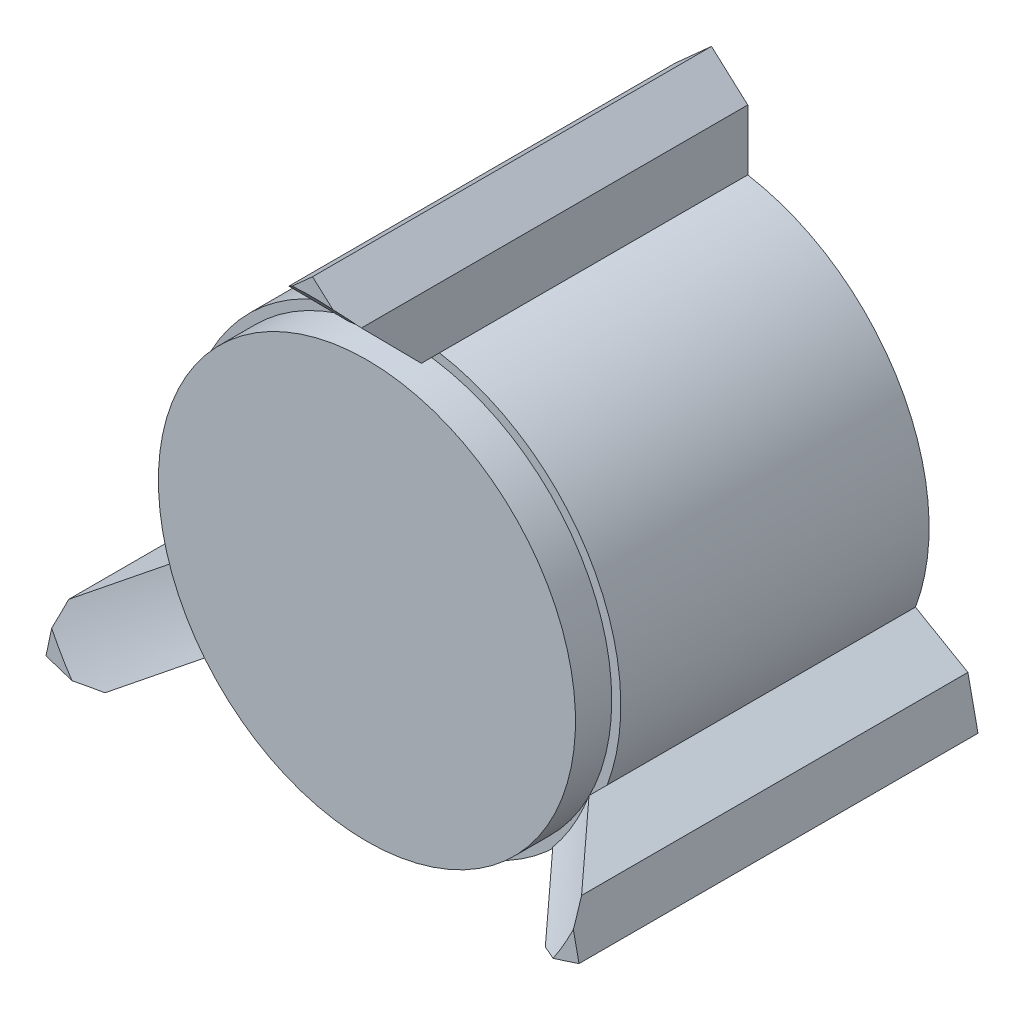
ISO-10303-21;
HEADER;
FILE_DESCRIPTION(('STEP AP214'),'2;1');
FILE_NAME('part.step','',(''),(''),'','','');
FILE_SCHEMA(('AUTOMOTIVE_DESIGN { 1 0 10303 214 1 1 1 1 }'));
ENDSEC;
DATA;
#1=APPLICATION_CONTEXT('core data for automotive mechanical design processes');
#2=APPLICATION_PROTOCOL_DEFINITION('international standard','automotive_design',2000,#1);
#3=PRODUCT_CONTEXT('',#1,'mechanical');
#4=PRODUCT('Part','Part','',(#3));
#5=PRODUCT_RELATED_PRODUCT_CATEGORY('part','',(#4));
#6=PRODUCT_DEFINITION_FORMATION('','',#4);
#7=PRODUCT_DEFINITION_CONTEXT('part definition',#1,'design');
#8=PRODUCT_DEFINITION('design','',#6,#7);
#9=PRODUCT_DEFINITION_SHAPE('','',#8);
#10=(LENGTH_UNIT() NAMED_UNIT(*) SI_UNIT(.MILLI.,.METRE.));
#11=(NAMED_UNIT(*) PLANE_ANGLE_UNIT() SI_UNIT($,.RADIAN.));
#12=(NAMED_UNIT(*) SI_UNIT($,.STERADIAN.) SOLID_ANGLE_UNIT());
#13=UNCERTAINTY_MEASURE_WITH_UNIT(LENGTH_MEASURE(1.E-05),#10,'distance_accuracy_value','');
#14=(GEOMETRIC_REPRESENTATION_CONTEXT(3) GLOBAL_UNCERTAINTY_ASSIGNED_CONTEXT((#13)) GLOBAL_UNIT_ASSIGNED_CONTEXT((#10,
#11,#12)) REPRESENTATION_CONTEXT('',''));
#15=CARTESIAN_POINT('',(0.,0.,0.));
#16=DIRECTION('',(0.,0.,1.));
#17=DIRECTION('',(1.,0.,0.));
#18=AXIS2_PLACEMENT_3D('',#15,#16,#17);
#19=CARTESIAN_POINT('',(0.,0.,12.));
#20=DIRECTION('',(0.,0.,-1.));
#21=DIRECTION('',(-1.,0.,0.));
#22=AXIS2_PLACEMENT_3D('',#19,#20,#21);
#23=CYLINDRICAL_SURFACE('',#22,12.);
#24=DIRECTION('',(0.,0.,-1.));
#25=VECTOR('',#24,1.);
#26=CARTESIAN_POINT('',(-9.2469507659596,-7.64813059066844,30.7456411372333));
#27=LINE('',#26,#25);
#28=CARTESIAN_POINT('',(-9.24695076595963,-7.64813059066846,12.));
#29=VERTEX_POINT('',#28);
#30=CARTESIAN_POINT('',(-9.2469507659596,-7.64813059066844,-5.));
#31=VERTEX_POINT('',#30);
#32=EDGE_CURVE('E418',#29,#31,#27,.T.);
#33=ORIENTED_EDGE('',*,*,#32,.T.);
#34=CARTESIAN_POINT('',(0.,0.,-5.));
#35=DIRECTION('',(0.,0.,-1.));
#36=DIRECTION('',(-1.,0.,0.));
#37=AXIS2_PLACEMENT_3D('',#34,#35,#36);
#38=CIRCLE('',#37,12.);
#39=CARTESIAN_POINT('',(9.24695076595962,-7.64813059066844,-5.));
#40=VERTEX_POINT('',#39);
#41=EDGE_CURVE('E218',#40,#31,#38,.T.);
#42=ORIENTED_EDGE('',*,*,#41,.F.);
#43=DIRECTION('',(0.,0.,-1.));
#44=VECTOR('',#43,1.);
#45=CARTESIAN_POINT('',(9.24695076595961,-7.64813059066843,30.7456411372333));
#46=LINE('',#45,#44);
#47=CARTESIAN_POINT('',(9.24695076595964,-7.64813059066845,12.));
#48=VERTEX_POINT('',#47);
#49=EDGE_CURVE('E461',#48,#40,#46,.T.);
#50=ORIENTED_EDGE('',*,*,#49,.F.);
#51=CARTESIAN_POINT('',(0.,0.,12.));
#52=DIRECTION('',(0.,0.,1.));
#53=DIRECTION('',(1.,0.,0.));
#54=AXIS2_PLACEMENT_3D('',#51,#52,#53);
#55=CIRCLE('',#54,12.);
#56=EDGE_CURVE('E248',#29,#48,#55,.T.);
#57=ORIENTED_EDGE('',*,*,#56,.F.);
#58=EDGE_LOOP('',(#33,#42,#50,#57));
#59=FACE_BOUND('',#58,.T.);
#60=ADVANCED_FACE('F43',(#59),#23,.T.);
#61=DIRECTION('',(0.,0.,-1.));
#62=VECTOR('',#61,1.);
#63=CARTESIAN_POINT('',(-11.2469507659596,-4.18402897553068,30.7456411372333));
#64=LINE('',#63,#62);
#65=CARTESIAN_POINT('',(-11.2469507659596,-4.18402897553069,12.));
#66=VERTEX_POINT('',#65);
#67=CARTESIAN_POINT('',(-11.2469507659596,-4.18402897553069,-5.));
#68=VERTEX_POINT('',#67);
#69=EDGE_CURVE('E444',#66,#68,#64,.T.);
#70=ORIENTED_EDGE('',*,*,#69,.F.);
#71=CARTESIAN_POINT('',(-2.,11.8321595661992,12.));
#72=VERTEX_POINT('',#71);
#73=EDGE_CURVE('E201',#72,#66,#55,.T.);
#74=ORIENTED_EDGE('',*,*,#73,.F.);
#75=DIRECTION('',(0.,0.,-1.));
#76=VECTOR('',#75,1.);
#77=CARTESIAN_POINT('',(-2.,11.8321595661992,12.));
#78=LINE('',#77,#76);
#79=CARTESIAN_POINT('',(-1.99999999999999,11.8321595661992,-5.));
#80=VERTEX_POINT('',#79);
#81=EDGE_CURVE('E194',#80,#72,#78,.F.);
#82=ORIENTED_EDGE('',*,*,#81,.F.);
#83=EDGE_CURVE('E198',#68,#80,#38,.T.);
#84=ORIENTED_EDGE('',*,*,#83,.F.);
#85=EDGE_LOOP('',(#70,#74,#82,#84));
#86=FACE_BOUND('',#85,.T.);
#87=ADVANCED_FACE('F197',(#86),#23,.T.);
#88=DIRECTION('',(0.,0.,-1.));
#89=VECTOR('',#88,1.);
#90=CARTESIAN_POINT('',(11.2469507659596,-4.18402897553067,30.7456411372333));
#91=LINE('',#90,#89);
#92=CARTESIAN_POINT('',(11.2469507659596,-4.18402897553068,12.));
#93=VERTEX_POINT('',#92);
#94=CARTESIAN_POINT('',(11.2469507659596,-4.18402897553068,-5.));
#95=VERTEX_POINT('',#94);
#96=EDGE_CURVE('E457',#93,#95,#91,.T.);
#97=ORIENTED_EDGE('',*,*,#96,.T.);
#98=CARTESIAN_POINT('',(2.,11.8321595661992,-5.));
#99=VERTEX_POINT('',#98);
#100=EDGE_CURVE('E220',#99,#95,#38,.T.);
#101=ORIENTED_EDGE('',*,*,#100,.F.);
#102=DIRECTION('',(0.,0.,-1.));
#103=VECTOR('',#102,1.);
#104=CARTESIAN_POINT('',(2.,11.8321595661992,12.));
#105=LINE('',#104,#103);
#106=CARTESIAN_POINT('',(2.,11.8321595661992,12.));
#107=VERTEX_POINT('',#106);
#108=EDGE_CURVE('E208',#107,#99,#105,.T.);
#109=ORIENTED_EDGE('',*,*,#108,.F.);
#110=EDGE_CURVE('E243',#93,#107,#55,.T.);
#111=ORIENTED_EDGE('',*,*,#110,.F.);
#112=EDGE_LOOP('',(#97,#101,#109,#111));
#113=FACE_BOUND('',#112,.T.);
#114=ADVANCED_FACE('F404',(#113),#23,.T.);
#115=CARTESIAN_POINT('',(0.,0.,12.));
#116=DIRECTION('',(0.,0.,1.));
#117=DIRECTION('',(1.,0.,0.));
#118=AXIS2_PLACEMENT_3D('',#115,#116,#117);
#119=PLANE('',#118);
#120=CARTESIAN_POINT('',(0.,0.,12.));
#121=DIRECTION('',(0.,0.,1.));
#122=DIRECTION('',(1.,0.,0.));
#123=AXIS2_PLACEMENT_3D('',#120,#121,#122);
#124=CIRCLE('',#123,11.5);
#125=CARTESIAN_POINT('',(11.5,0.,12.));
#126=VERTEX_POINT('',#125);
#127=EDGE_CURVE('E247',#126,#126,#124,.T.);
#128=ORIENTED_EDGE('',*,*,#127,.F.);
#129=EDGE_LOOP('',(#128));
#130=FACE_BOUND('',#129,.T.);
#131=EDGE_CURVE('E244',#107,#72,#55,.T.);
#132=ORIENTED_EDGE('',*,*,#131,.T.);
#133=ORIENTED_EDGE('',*,*,#73,.T.);
#134=CARTESIAN_POINT('',(0.,0.,12.));
#135=DIRECTION('',(0.,0.,1.));
#136=DIRECTION('',(1.,0.,0.));
#137=AXIS2_PLACEMENT_3D('',#134,#135,#136);
#138=CIRCLE('',#137,12.);
#139=EDGE_CURVE('E448',#66,#29,#138,.T.);
#140=ORIENTED_EDGE('',*,*,#139,.T.);
#141=ORIENTED_EDGE('',*,*,#56,.T.);
#142=CARTESIAN_POINT('',(0.,0.,12.));
#143=DIRECTION('',(0.,0.,1.));
#144=DIRECTION('',(1.,0.,0.));
#145=AXIS2_PLACEMENT_3D('',#142,#143,#144);
#146=CIRCLE('',#145,12.);
#147=EDGE_CURVE('E233',#48,#93,#146,.T.);
#148=ORIENTED_EDGE('',*,*,#147,.T.);
#149=ORIENTED_EDGE('',*,*,#110,.T.);
#150=EDGE_LOOP('',(#132,#133,#140,#141,#148,#149));
#151=FACE_BOUND('',#150,.T.);
#152=ADVANCED_FACE('F401',(#130,#151),#119,.T.);
#153=CARTESIAN_POINT('',(0.,0.,12.));
#154=DIRECTION('',(0.,0.,-1.));
#155=DIRECTION('',(0.,1.,0.));
#156=AXIS2_PLACEMENT_3D('',#153,#154,#155);
#157=CYLINDRICAL_SURFACE('',#156,11.5);
#158=CARTESIAN_POINT('',(0.,0.,14.));
#159=DIRECTION('',(0.,0.,-1.));
#160=DIRECTION('',(0.,1.,0.));
#161=AXIS2_PLACEMENT_3D('',#158,#159,#160);
#162=CIRCLE('',#161,11.5);
#163=CARTESIAN_POINT('',(0.,11.5,14.));
#164=VERTEX_POINT('',#163);
#165=EDGE_CURVE('E239',#164,#164,#162,.T.);
#166=ORIENTED_EDGE('',*,*,#165,.T.);
#167=EDGE_LOOP('',(#166));
#168=FACE_BOUND('',#167,.T.);
#169=ORIENTED_EDGE('',*,*,#127,.T.);
#170=EDGE_LOOP('',(#169));
#171=FACE_BOUND('',#170,.T.);
#172=ADVANCED_FACE('F397',(#168,#171),#157,.T.);
#173=CARTESIAN_POINT('',(0.,11.5,14.));
#174=DIRECTION('',(0.,0.,1.));
#175=DIRECTION('',(0.,-1.,0.));
#176=AXIS2_PLACEMENT_3D('',#173,#174,#175);
#177=PLANE('',#176);
#178=ORIENTED_EDGE('',*,*,#165,.F.);
#179=EDGE_LOOP('',(#178));
#180=FACE_BOUND('',#179,.T.);
#181=ADVANCED_FACE('F389',(#180),#177,.T.);
#182=CARTESIAN_POINT('',(-2.,16.8819430161342,30.7456411372333));
#183=DIRECTION('',(1.,0.,0.));
#184=DIRECTION('',(0.,1.,0.));
#185=AXIS2_PLACEMENT_3D('',#182,#183,#184);
#186=PLANE('',#185);
#187=DIRECTION('',(0.,0.,-1.));
#188=VECTOR('',#187,1.);
#189=CARTESIAN_POINT('',(-2.,11.8321595661993,30.7456411372333));
#190=LINE('',#189,#188);
#191=CARTESIAN_POINT('',(-2.,11.8321595661993,13.));
#192=VERTEX_POINT('',#191);
#193=EDGE_CURVE('E225',#192,#72,#190,.T.);
#194=ORIENTED_EDGE('',*,*,#193,.F.);
#195=CARTESIAN_POINT('',(-2.,11.8321595661993,13.));
#196=CARTESIAN_POINT('',(-2.,12.1109211158368,13.2748665394307));
#197=CARTESIAN_POINT('',(-2.,12.3895517622911,13.5498657628408));
#198=CARTESIAN_POINT('',(-2.,12.9465913662465,14.1000884014354));
#199=CARTESIAN_POINT('',(-2.,13.2250003238489,14.3753118165174));
#200=CARTESIAN_POINT('',(-2.,13.781636880291,14.9259418720893));
#201=CARTESIAN_POINT('',(-2.,14.0598644791582,15.2013485125516));
#202=CARTESIAN_POINT('',(-2.,14.6161663032564,15.7523169105655));
#203=CARTESIAN_POINT('',(-2.,14.8942405284174,16.0278786681878));
#204=CARTESIAN_POINT('',(-2.,15.1722519114186,16.3035037838902));
#205=B_SPLINE_CURVE_WITH_KNOTS('',3,(#195,#196,#197,#198,#199,#200,#201,#202,#203,#204),
.UNSPECIFIED.,.F.,.F.,(4,2,2,2,4),(0.,1.17445147402427,2.34890241094299,3.52335317013223,
4.6978044645796),.UNSPECIFIED.);
#206=CARTESIAN_POINT('',(-2.,15.1722519114186,16.3035037838902));
#207=VERTEX_POINT('',#206);
#208=EDGE_CURVE('E370',#192,#207,#205,.T.);
#209=ORIENTED_EDGE('',*,*,#208,.T.);
#210=DIRECTION('',(0.,0.,-1.));
#211=VECTOR('',#210,1.);
#212=CARTESIAN_POINT('',(-2.,15.1722519114186,30.7456411372333));
#213=LINE('',#212,#211);
#214=CARTESIAN_POINT('',(-2.,15.1722519114186,-5.));
#215=VERTEX_POINT('',#214);
#216=EDGE_CURVE('E223',#207,#215,#213,.T.);
#217=ORIENTED_EDGE('',*,*,#216,.T.);
#218=DIRECTION('',(0.,1.,0.));
#219=VECTOR('',#218,1.);
#220=CARTESIAN_POINT('',(-2.,16.8819430161342,-5.));
#221=LINE('',#220,#219);
#222=EDGE_CURVE('E213',#80,#215,#221,.T.);
#223=ORIENTED_EDGE('',*,*,#222,.F.);
#224=ORIENTED_EDGE('',*,*,#81,.T.);
#225=EDGE_LOOP('',(#194,#209,#217,#223,#224));
#226=FACE_BOUND('',#225,.T.);
#227=ADVANCED_FACE('F221',(#226),#186,.F.);
#228=CARTESIAN_POINT('',(0.,0.,30.7456411372333));
#229=DIRECTION('',(0.,0.,-1.));
#230=DIRECTION('',(-1.,0.,0.));
#231=AXIS2_PLACEMENT_3D('',#228,#229,#230);
#232=CYLINDRICAL_SURFACE('',#231,12.0000000000001);
#233=DIRECTION('',(0.,0.,-1.));
#234=VECTOR('',#233,1.);
#235=CARTESIAN_POINT('',(2.,11.8321595661993,30.7456411372333));
#236=LINE('',#235,#234);
#237=CARTESIAN_POINT('',(2.,11.8321595661993,13.));
#238=VERTEX_POINT('',#237);
#239=EDGE_CURVE('E230',#238,#107,#236,.T.);
#240=ORIENTED_EDGE('',*,*,#239,.F.);
#241=CARTESIAN_POINT('',(0.,0.,13.));
#242=DIRECTION('',(0.,0.,1.));
#243=DIRECTION('',(1.,0.,0.));
#244=AXIS2_PLACEMENT_3D('',#241,#242,#243);
#245=CIRCLE('',#244,12.0000000000001);
#246=EDGE_CURVE('E378',#238,#192,#245,.T.);
#247=ORIENTED_EDGE('',*,*,#246,.T.);
#248=ORIENTED_EDGE('',*,*,#193,.T.);
#249=ORIENTED_EDGE('',*,*,#131,.F.);
#250=EDGE_LOOP('',(#240,#247,#248,#249));
#251=FACE_BOUND('',#250,.T.);
#252=ADVANCED_FACE('F388',(#251),#232,.F.);
#253=CARTESIAN_POINT('',(2.,11.8321595661993,30.7456411372333));
#254=DIRECTION('',(-1.,0.,0.));
#255=DIRECTION('',(0.,-1.,0.));
#256=AXIS2_PLACEMENT_3D('',#253,#254,#255);
#257=PLANE('',#256);
#258=DIRECTION('',(0.,0.,1.));
#259=VECTOR('',#258,1.);
#260=CARTESIAN_POINT('',(2.,15.1722519114186,30.7456411372333));
#261=LINE('',#260,#259);
#262=CARTESIAN_POINT('',(2.,15.1722519114186,-5.));
#263=VERTEX_POINT('',#262);
#264=CARTESIAN_POINT('',(2.,15.1722519114186,16.3035037838902));
#265=VERTEX_POINT('',#264);
#266=EDGE_CURVE('E259',#263,#265,#261,.T.);
#267=ORIENTED_EDGE('',*,*,#266,.T.);
#268=CARTESIAN_POINT('',(2.,15.1722519114186,16.3035037838902));
#269=CARTESIAN_POINT('',(2.,14.8942405284174,16.0278786681878));
#270=CARTESIAN_POINT('',(2.,14.6161663032564,15.7523169105655));
#271=CARTESIAN_POINT('',(2.,14.0598644791582,15.2013485125516));
#272=CARTESIAN_POINT('',(2.,13.781636880291,14.9259418720893));
#273=CARTESIAN_POINT('',(2.,13.2250003238489,14.3753118165174));
#274=CARTESIAN_POINT('',(2.,12.9465913662465,14.1000884014354));
#275=CARTESIAN_POINT('',(2.,12.3895517622911,13.5498657628408));
#276=CARTESIAN_POINT('',(2.,12.1109211158368,13.2748665394307));
#277=CARTESIAN_POINT('',(2.,11.8321595661993,13.));
#278=B_SPLINE_CURVE_WITH_KNOTS('',3,(#268,#269,#270,#271,#272,#273,#274,#275,#276,#277),
.UNSPECIFIED.,.F.,.F.,(4,2,2,2,4),(0.,1.17445129444737,2.34890205363661,3.52335299055532,
4.69780446457959),.UNSPECIFIED.);
#279=EDGE_CURVE('E337',#265,#238,#278,.T.);
#280=ORIENTED_EDGE('',*,*,#279,.T.);
#281=ORIENTED_EDGE('',*,*,#239,.T.);
#282=ORIENTED_EDGE('',*,*,#108,.T.);
#283=DIRECTION('',(0.,-1.,0.));
#284=VECTOR('',#283,1.);
#285=CARTESIAN_POINT('',(2.,11.8321595661993,-5.));
#286=LINE('',#285,#284);
#287=EDGE_CURVE('E226',#263,#99,#286,.T.);
#288=ORIENTED_EDGE('',*,*,#287,.F.);
#289=EDGE_LOOP('',(#267,#280,#281,#282,#288));
#290=FACE_BOUND('',#289,.T.);
#291=ADVANCED_FACE('F393',(#290),#257,.F.);
#292=CARTESIAN_POINT('',(0.,0.,17.));
#293=DIRECTION('',(0.,0.,1.));
#294=DIRECTION('',(1.,0.,0.));
#295=AXIS2_PLACEMENT_3D('',#292,#293,#294);
#296=PLANE('',#295);
#297=DIRECTION('',(0.743764886323458,0.668441316700467,0.));
#298=VECTOR('',#297,1.);
#299=CARTESIAN_POINT('',(-8.43671259471871,9.38740683315135,17.));
#300=LINE('',#299,#298);
#301=CARTESIAN_POINT('',(0.,16.96970518998,17.));
#302=VERTEX_POINT('',#301);
#303=CARTESIAN_POINT('',(-1.12287217277841,15.960550055797,17.));
#304=VERTEX_POINT('',#303);
#305=EDGE_CURVE('E263',#302,#304,#300,.F.);
#306=ORIENTED_EDGE('',*,*,#305,.T.);
#307=CARTESIAN_POINT('',(0.,0.,17.));
#308=DIRECTION('',(0.,0.,1.));
#309=DIRECTION('',(1.,0.,0.));
#310=AXIS2_PLACEMENT_3D('',#307,#308,#309);
#311=CIRCLE('',#310,16.0000000000001);
#312=CARTESIAN_POINT('',(1.1228721727784,15.960550055797,17.));
#313=VERTEX_POINT('',#312);
#314=EDGE_CURVE('E312',#304,#313,#311,.F.);
#315=ORIENTED_EDGE('',*,*,#314,.T.);
#316=DIRECTION('',(0.743764886323458,-0.668441316700467,0.));
#317=VECTOR('',#316,1.);
#318=CARTESIAN_POINT('',(8.43671259471871,9.38740683315135,17.));
#319=LINE('',#318,#317);
#320=EDGE_CURVE('E267',#313,#302,#319,.F.);
#321=ORIENTED_EDGE('',*,*,#320,.T.);
#322=EDGE_LOOP('',(#306,#315,#321));
#323=FACE_BOUND('',#322,.T.);
#324=ADVANCED_FACE('F390',(#323),#296,.T.);
#325=CARTESIAN_POINT('',(0.,0.,-5.));
#326=DIRECTION('',(0.,0.,1.));
#327=DIRECTION('',(1.,0.,0.));
#328=AXIS2_PLACEMENT_3D('',#325,#326,#327);
#329=PLANE('',#328);
#330=DIRECTION('',(-0.743764886323458,-0.668441316700467,0.));
#331=VECTOR('',#330,1.);
#332=CARTESIAN_POINT('',(-2.,15.1722519114186,-5.));
#333=LINE('',#332,#331);
#334=CARTESIAN_POINT('',(0.,16.96970518998,-5.));
#335=VERTEX_POINT('',#334);
#336=EDGE_CURVE('E207',#215,#335,#333,.F.);
#337=ORIENTED_EDGE('',*,*,#336,.T.);
#338=DIRECTION('',(-0.743764886323458,0.668441316700467,0.));
#339=VECTOR('',#338,1.);
#340=CARTESIAN_POINT('',(-0.0336714886521954,16.9999666538159,-5.));
#341=LINE('',#340,#339);
#342=EDGE_CURVE('E256',#335,#263,#341,.F.);
#343=ORIENTED_EDGE('',*,*,#342,.T.);
#344=ORIENTED_EDGE('',*,*,#287,.T.);
#345=ORIENTED_EDGE('',*,*,#100,.T.);
#346=DIRECTION('',(0.866025403784439,-0.499999999999999,0.));
#347=VECTOR('',#346,1.);
#348=CARTESIAN_POINT('',(15.6201915172134,-6.70892070049812,-5.));
#349=LINE('',#348,#347);
#350=CARTESIAN_POINT('',(14.1395555879055,-5.85407514814032,-5.));
#351=VERTEX_POINT('',#350);
#352=EDGE_CURVE('E453',#95,#351,#349,.T.);
#353=ORIENTED_EDGE('',*,*,#352,.T.);
#354=DIRECTION('',(-0.207004718039996,0.978339944349193,0.));
#355=VECTOR('',#354,1.);
#356=CARTESIAN_POINT('',(14.1395555879055,-5.85407514814032,-5.));
#357=LINE('',#356,#355);
#358=CARTESIAN_POINT('',(14.6961957892552,-8.48485259498989,-5.));
#359=VERTEX_POINT('',#358);
#360=EDGE_CURVE('E292',#351,#359,#357,.F.);
#361=ORIENTED_EDGE('',*,*,#360,.T.);
#362=DIRECTION('',(0.950769604363452,0.309898627648727,0.));
#363=VECTOR('',#362,1.);
#364=CARTESIAN_POINT('',(14.739238730019,-8.47082296235183,-5.));
#365=LINE('',#364,#363);
#366=CARTESIAN_POINT('',(12.1395555879055,-9.31817676327808,-5.));
#367=VERTEX_POINT('',#366);
#368=EDGE_CURVE('E295',#359,#367,#365,.F.);
#369=ORIENTED_EDGE('',*,*,#368,.T.);
#370=DIRECTION('',(-0.866025403784439,0.5,0.));
#371=VECTOR('',#370,1.);
#372=CARTESIAN_POINT('',(9.2469507659596,-7.64813059066843,-5.));
#373=LINE('',#372,#371);
#374=EDGE_CURVE('E433',#367,#40,#373,.T.);
#375=ORIENTED_EDGE('',*,*,#374,.T.);
#376=ORIENTED_EDGE('',*,*,#41,.T.);
#377=DIRECTION('',(-0.866025403784438,-0.500000000000001,0.));
#378=VECTOR('',#377,1.);
#379=CARTESIAN_POINT('',(-13.6201915172134,-10.1730223156359,-5.));
#380=LINE('',#379,#378);
#381=CARTESIAN_POINT('',(-12.1395555879055,-9.31817676327809,-5.));
#382=VERTEX_POINT('',#381);
#383=EDGE_CURVE('E429',#31,#382,#380,.T.);
#384=ORIENTED_EDGE('',*,*,#383,.T.);
#385=DIRECTION('',(0.950769604363453,-0.309898627648726,0.));
#386=VECTOR('',#385,1.);
#387=CARTESIAN_POINT('',(-12.1395555879055,-9.31817676327809,-5.));
#388=LINE('',#387,#386);
#389=CARTESIAN_POINT('',(-14.6961957892552,-8.4848525949899,-5.));
#390=VERTEX_POINT('',#389);
#391=EDGE_CURVE('E278',#382,#390,#388,.F.);
#392=ORIENTED_EDGE('',*,*,#391,.T.);
#393=DIRECTION('',(-0.207004718039995,-0.978339944349193,0.));
#394=VECTOR('',#393,1.);
#395=CARTESIAN_POINT('',(-14.7055672413668,-8.52914369146392,-5.));
#396=LINE('',#395,#394);
#397=CARTESIAN_POINT('',(-14.1395555879055,-5.85407514814033,-5.));
#398=VERTEX_POINT('',#397);
#399=EDGE_CURVE('E275',#390,#398,#396,.F.);
#400=ORIENTED_EDGE('',*,*,#399,.T.);
#401=DIRECTION('',(0.866025403784439,0.5,0.));
#402=VECTOR('',#401,1.);
#403=CARTESIAN_POINT('',(-11.2469507659596,-4.18402897553068,-5.));
#404=LINE('',#403,#402);
#405=EDGE_CURVE('E216',#398,#68,#404,.T.);
#406=ORIENTED_EDGE('',*,*,#405,.T.);
#407=ORIENTED_EDGE('',*,*,#83,.T.);
#408=ORIENTED_EDGE('',*,*,#222,.T.);
#409=EDGE_LOOP('',(#337,#343,#344,#345,#353,#361,#369,#375,#376,#384,#392,#400,#406,#407,#408));
#410=FACE_BOUND('',#409,.T.);
#411=ADVANCED_FACE('F212',(#410),#329,.F.);
#412=CARTESIAN_POINT('',(15.6201915172134,-6.70892070049812,30.7456411372333));
#413=DIRECTION('',(-0.499999999999999,-0.866025403784439,0.));
#414=DIRECTION('',(0.866025403784439,-0.499999999999999,0.));
#415=AXIS2_PLACEMENT_3D('',#412,#413,#414);
#416=PLANE('',#415);
#417=CARTESIAN_POINT('',(11.2469507659596,-4.18402897553067,13.));
#418=VERTEX_POINT('',#417);
#419=EDGE_CURVE('E458',#418,#93,#91,.T.);
#420=ORIENTED_EDGE('',*,*,#419,.F.);
#421=CARTESIAN_POINT('',(11.2469507659596,-4.18402897553067,13.));
#422=CARTESIAN_POINT('',(11.488365349544,-4.32340975034941,13.2748665394307));
#423=CARTESIAN_POINT('',(11.7296665676463,-4.46272507357658,13.5498657628408));
#424=CARTESIAN_POINT('',(12.2120770155857,-4.74124487555427,14.1000884014355));
#425=CARTESIAN_POINT('',(12.4531862455105,-4.88044935435546,14.3753118165174));
#426=CARTESIAN_POINT('',(12.9352476440645,-5.15876763257652,14.9259418720894));
#427=CARTESIAN_POINT('',(13.1761998127174,-5.29788143201011,15.2013485125517));
#428=CARTESIAN_POINT('',(13.657971324558,-5.5760323440592,15.7523169105656));
#429=CARTESIAN_POINT('',(13.8987906676852,-5.71506945663974,16.0278786681878));
#430=CARTESIAN_POINT('',(14.1395555879055,-5.85407514814032,16.3035037838903));
#431=B_SPLINE_CURVE_WITH_KNOTS('',3,(#421,#422,#423,#424,#425,#426,#427,#428,#429,#430),
.UNSPECIFIED.,.F.,.F.,(4,2,2,2,4),(0.,1.17445147402428,2.34890241094299,3.52335317013224,
4.69780446457961),.UNSPECIFIED.);
#432=CARTESIAN_POINT('',(14.1395555879055,-5.85407514814032,16.3035037838903));
#433=VERTEX_POINT('',#432);
#434=EDGE_CURVE('E59',#418,#433,#431,.T.);
#435=ORIENTED_EDGE('',*,*,#434,.T.);
#436=DIRECTION('',(0.,0.,-1.));
#437=VECTOR('',#436,1.);
#438=CARTESIAN_POINT('',(14.1395555879055,-5.85407514814032,30.7456411372333));
#439=LINE('',#438,#437);
#440=EDGE_CURVE('E309',#433,#351,#439,.T.);
#441=ORIENTED_EDGE('',*,*,#440,.T.);
#442=ORIENTED_EDGE('',*,*,#352,.F.);
#443=ORIENTED_EDGE('',*,*,#96,.F.);
#444=EDGE_LOOP('',(#420,#435,#441,#442,#443));
#445=FACE_BOUND('',#444,.T.);
#446=ADVANCED_FACE('F473',(#445),#416,.F.);
#447=CARTESIAN_POINT('',(0.,0.,30.7456411372333));
#448=DIRECTION('',(0.,0.,-1.));
#449=DIRECTION('',(-1.,0.,0.));
#450=AXIS2_PLACEMENT_3D('',#447,#448,#449);
#451=CYLINDRICAL_SURFACE('',#450,12.);
#452=CARTESIAN_POINT('',(9.24695076595961,-7.64813059066843,13.));
#453=VERTEX_POINT('',#452);
#454=EDGE_CURVE('E462',#453,#48,#46,.T.);
#455=ORIENTED_EDGE('',*,*,#454,.F.);
#456=CARTESIAN_POINT('',(0.,0.,13.));
#457=DIRECTION('',(0.,0.,1.));
#458=DIRECTION('',(1.,0.,0.));
#459=AXIS2_PLACEMENT_3D('',#456,#457,#458);
#460=CIRCLE('',#459,12.);
#461=EDGE_CURVE('E73',#453,#418,#460,.T.);
#462=ORIENTED_EDGE('',*,*,#461,.T.);
#463=ORIENTED_EDGE('',*,*,#419,.T.);
#464=ORIENTED_EDGE('',*,*,#147,.F.);
#465=EDGE_LOOP('',(#455,#462,#463,#464));
#466=FACE_BOUND('',#465,.T.);
#467=ADVANCED_FACE('F532',(#466),#451,.F.);
#468=CARTESIAN_POINT('',(9.2469507659596,-7.64813059066843,30.7456411372333));
#469=DIRECTION('',(0.5,0.866025403784439,0.));
#470=DIRECTION('',(-0.866025403784439,0.5,0.));
#471=AXIS2_PLACEMENT_3D('',#468,#469,#470);
#472=PLANE('',#471);
#473=DIRECTION('',(0.,0.,1.));
#474=VECTOR('',#473,1.);
#475=CARTESIAN_POINT('',(12.1395555879055,-9.31817676327808,30.7456411372333));
#476=LINE('',#475,#474);
#477=CARTESIAN_POINT('',(12.1395555879055,-9.31817676327808,16.3035037838903));
#478=VERTEX_POINT('',#477);
#479=EDGE_CURVE('E298',#367,#478,#476,.T.);
#480=ORIENTED_EDGE('',*,*,#479,.T.);
#481=CARTESIAN_POINT('',(12.1395555879055,-9.31817676327808,16.3035037838903));
#482=CARTESIAN_POINT('',(11.8987906676852,-9.1791710717775,16.0278786681878));
#483=CARTESIAN_POINT('',(11.657971324558,-9.04013395919696,15.7523169105656));
#484=CARTESIAN_POINT('',(11.1761998127174,-8.76198304714787,15.2013485125517));
#485=CARTESIAN_POINT('',(10.9352476440645,-8.62286924771429,14.9259418720894));
#486=CARTESIAN_POINT('',(10.4531862455105,-8.34455096949323,14.3753118165174));
#487=CARTESIAN_POINT('',(10.2120770155857,-8.20534649069203,14.1000884014355));
#488=CARTESIAN_POINT('',(9.72966656764631,-7.92682668871434,13.5498657628408));
#489=CARTESIAN_POINT('',(9.48836534954399,-7.78751136548718,13.2748665394307));
#490=CARTESIAN_POINT('',(9.24695076595961,-7.64813059066843,13.));
#491=B_SPLINE_CURVE_WITH_KNOTS('',3,(#481,#482,#483,#484,#485,#486,#487,#488,#489,#490),
.UNSPECIFIED.,.F.,.F.,(4,2,2,2,4),(0.,1.17445129444737,2.34890205363661,3.52335299055533,
4.6978044645796),.UNSPECIFIED.);
#492=EDGE_CURVE('E536',#478,#453,#491,.T.);
#493=ORIENTED_EDGE('',*,*,#492,.T.);
#494=ORIENTED_EDGE('',*,*,#454,.T.);
#495=ORIENTED_EDGE('',*,*,#49,.T.);
#496=ORIENTED_EDGE('',*,*,#374,.F.);
#497=EDGE_LOOP('',(#480,#493,#494,#495,#496));
#498=FACE_BOUND('',#497,.T.);
#499=ADVANCED_FACE('F528',(#498),#472,.F.);
#500=CARTESIAN_POINT('',(0.,0.,17.));
#501=DIRECTION('',(0.,0.,1.));
#502=DIRECTION('',(1.,0.,0.));
#503=AXIS2_PLACEMENT_3D('',#500,#501,#502);
#504=PLANE('',#503);
#505=DIRECTION('',(0.207004718039996,-0.978339944349193,0.));
#506=VECTOR('',#505,1.);
#507=CARTESIAN_POINT('',(12.348089090528,2.61270401487887,17.));
#508=LINE('',#507,#506);
#509=CARTESIAN_POINT('',(14.6961957892552,-8.48485259498989,17.));
#510=VERTEX_POINT('',#509);
#511=CARTESIAN_POINT('',(14.3836778930825,-7.00783920106965,17.));
#512=VERTEX_POINT('',#511);
#513=EDGE_CURVE('E302',#510,#512,#508,.F.);
#514=ORIENTED_EDGE('',*,*,#513,.T.);
#515=CARTESIAN_POINT('',(0.,0.,17.));
#516=DIRECTION('',(0.,0.,1.));
#517=DIRECTION('',(1.,0.,0.));
#518=AXIS2_PLACEMENT_3D('',#515,#516,#517);
#519=CIRCLE('',#518,16.);
#520=CARTESIAN_POINT('',(13.2608057203041,-8.95271085472716,17.));
#521=VERTEX_POINT('',#520);
#522=EDGE_CURVE('E501',#512,#521,#519,.F.);
#523=ORIENTED_EDGE('',*,*,#522,.T.);
#524=DIRECTION('',(-0.950769604363452,-0.309898627648727,0.));
#525=VECTOR('',#524,1.);
#526=CARTESIAN_POINT('',(3.91137649580932,-12.0001108480301,17.));
#527=LINE('',#526,#525);
#528=EDGE_CURVE('E306',#521,#510,#527,.F.);
#529=ORIENTED_EDGE('',*,*,#528,.T.);
#530=EDGE_LOOP('',(#514,#523,#529));
#531=FACE_BOUND('',#530,.T.);
#532=ADVANCED_FACE('F521',(#531),#504,.T.);
#533=CARTESIAN_POINT('',(-13.6201915172134,-10.1730223156359,30.7456411372333));
#534=DIRECTION('',(-0.500000000000001,0.866025403784438,0.));
#535=DIRECTION('',(-0.866025403784438,-0.500000000000001,0.));
#536=AXIS2_PLACEMENT_3D('',#533,#534,#535);
#537=PLANE('',#536);
#538=CARTESIAN_POINT('',(-9.2469507659596,-7.64813059066844,13.));
#539=VERTEX_POINT('',#538);
#540=EDGE_CURVE('E428',#539,#29,#27,.T.);
#541=ORIENTED_EDGE('',*,*,#540,.F.);
#542=CARTESIAN_POINT('',(-9.24695076595961,-7.64813059066844,13.));
#543=CARTESIAN_POINT('',(-9.48836534954398,-7.78751136548718,13.2748665394307));
#544=CARTESIAN_POINT('',(-9.72966656764631,-7.92682668871435,13.5498657628408));
#545=CARTESIAN_POINT('',(-10.2120770155857,-8.20534649069204,14.1000884014354));
#546=CARTESIAN_POINT('',(-10.4531862455105,-8.34455096949323,14.3753118165174));
#547=CARTESIAN_POINT('',(-10.9352476440645,-8.62286924771429,14.9259418720893));
#548=CARTESIAN_POINT('',(-11.1761998127174,-8.76198304714788,15.2013485125516));
#549=CARTESIAN_POINT('',(-11.657971324558,-9.04013395919697,15.7523169105656));
#550=CARTESIAN_POINT('',(-11.8987906676852,-9.1791710717775,16.0278786681878));
#551=CARTESIAN_POINT('',(-12.1395555879055,-9.31817676327809,16.3035037838902));
#552=B_SPLINE_CURVE_WITH_KNOTS('',3,(#542,#543,#544,#545,#546,#547,#548,#549,#550,#551),
.UNSPECIFIED.,.F.,.F.,(4,2,2,2,4),(0.,1.17445147402427,2.34890241094298,3.52335317013222,
4.69780446457959),.UNSPECIFIED.);
#553=CARTESIAN_POINT('',(-12.1395555879055,-9.31817676327809,16.3035037838902));
#554=VERTEX_POINT('',#553);
#555=EDGE_CURVE('E491',#539,#554,#552,.T.);
#556=ORIENTED_EDGE('',*,*,#555,.T.);
#557=DIRECTION('',(0.,0.,-1.));
#558=VECTOR('',#557,1.);
#559=CARTESIAN_POINT('',(-12.1395555879055,-9.31817676327809,30.7456411372333));
#560=LINE('',#559,#558);
#561=EDGE_CURVE('E272',#554,#382,#560,.T.);
#562=ORIENTED_EDGE('',*,*,#561,.T.);
#563=ORIENTED_EDGE('',*,*,#383,.F.);
#564=ORIENTED_EDGE('',*,*,#32,.F.);
#565=EDGE_LOOP('',(#541,#556,#562,#563,#564));
#566=FACE_BOUND('',#565,.T.);
#567=ADVANCED_FACE('F435',(#566),#537,.F.);
#568=CARTESIAN_POINT('',(0.,0.,30.7456411372333));
#569=DIRECTION('',(0.,0.,-1.));
#570=DIRECTION('',(-1.,0.,0.));
#571=AXIS2_PLACEMENT_3D('',#568,#569,#570);
#572=CYLINDRICAL_SURFACE('',#571,12.);
#573=CARTESIAN_POINT('',(-11.2469507659596,-4.18402897553068,13.));
#574=VERTEX_POINT('',#573);
#575=EDGE_CURVE('E445',#574,#66,#64,.T.);
#576=ORIENTED_EDGE('',*,*,#575,.F.);
#577=CARTESIAN_POINT('',(0.,0.,13.));
#578=DIRECTION('',(0.,0.,1.));
#579=DIRECTION('',(1.,0.,0.));
#580=AXIS2_PLACEMENT_3D('',#577,#578,#579);
#581=CIRCLE('',#580,12.);
#582=EDGE_CURVE('E489',#574,#539,#581,.T.);
#583=ORIENTED_EDGE('',*,*,#582,.T.);
#584=ORIENTED_EDGE('',*,*,#540,.T.);
#585=ORIENTED_EDGE('',*,*,#139,.F.);
#586=EDGE_LOOP('',(#576,#583,#584,#585));
#587=FACE_BOUND('',#586,.T.);
#588=ADVANCED_FACE('F487',(#587),#572,.F.);
#589=CARTESIAN_POINT('',(-11.2469507659596,-4.18402897553068,30.7456411372333));
#590=DIRECTION('',(0.5,-0.866025403784439,0.));
#591=DIRECTION('',(0.866025403784439,0.5,0.));
#592=AXIS2_PLACEMENT_3D('',#589,#590,#591);
#593=PLANE('',#592);
#594=DIRECTION('',(0.,0.,1.));
#595=VECTOR('',#594,1.);
#596=CARTESIAN_POINT('',(-14.1395555879055,-5.85407514814033,30.7456411372333));
#597=LINE('',#596,#595);
#598=CARTESIAN_POINT('',(-14.1395555879055,-5.85407514814033,16.3035037838902));
#599=VERTEX_POINT('',#598);
#600=EDGE_CURVE('E288',#398,#599,#597,.T.);
#601=ORIENTED_EDGE('',*,*,#600,.T.);
#602=CARTESIAN_POINT('',(-14.1395555879055,-5.85407514814033,16.3035037838902));
#603=CARTESIAN_POINT('',(-13.8987906676852,-5.71506945663975,16.0278786681878));
#604=CARTESIAN_POINT('',(-13.657971324558,-5.57603234405922,15.7523169105656));
#605=CARTESIAN_POINT('',(-13.1761998127174,-5.29788143201012,15.2013485125517));
#606=CARTESIAN_POINT('',(-12.9352476440645,-5.15876763257653,14.9259418720894));
#607=CARTESIAN_POINT('',(-12.4531862455105,-4.88044935435547,14.3753118165174));
#608=CARTESIAN_POINT('',(-12.2120770155857,-4.74124487555428,14.1000884014354));
#609=CARTESIAN_POINT('',(-11.7296665676463,-4.46272507357658,13.5498657628408));
#610=CARTESIAN_POINT('',(-11.488365349544,-4.32340975034942,13.2748665394307));
#611=CARTESIAN_POINT('',(-11.2469507659596,-4.18402897553068,13.));
#612=B_SPLINE_CURVE_WITH_KNOTS('',3,(#602,#603,#604,#605,#606,#607,#608,#609,#610,#611),
.UNSPECIFIED.,.F.,.F.,(4,2,2,2,4),(0.,1.17445129444737,2.34890205363662,3.52335299055534,
4.69780446457961),.UNSPECIFIED.);
#613=EDGE_CURVE('E503',#599,#574,#612,.T.);
#614=ORIENTED_EDGE('',*,*,#613,.T.);
#615=ORIENTED_EDGE('',*,*,#575,.T.);
#616=ORIENTED_EDGE('',*,*,#69,.T.);
#617=ORIENTED_EDGE('',*,*,#405,.F.);
#618=EDGE_LOOP('',(#601,#614,#615,#616,#617));
#619=FACE_BOUND('',#618,.T.);
#620=ADVANCED_FACE('F480',(#619),#593,.F.);
#621=CARTESIAN_POINT('',(0.,0.,17.));
#622=DIRECTION('',(0.,0.,1.));
#623=DIRECTION('',(1.,0.,0.));
#624=AXIS2_PLACEMENT_3D('',#621,#622,#623);
#625=PLANE('',#624);
#626=DIRECTION('',(-0.950769604363453,0.309898627648726,0.));
#627=VECTOR('',#626,1.);
#628=CARTESIAN_POINT('',(-3.9113764958093,-12.0001108480301,17.));
#629=LINE('',#628,#627);
#630=CARTESIAN_POINT('',(-14.6961957892552,-8.4848525949899,17.));
#631=VERTEX_POINT('',#630);
#632=CARTESIAN_POINT('',(-13.2608057203041,-8.95271085472716,17.));
#633=VERTEX_POINT('',#632);
#634=EDGE_CURVE('E284',#631,#633,#629,.F.);
#635=ORIENTED_EDGE('',*,*,#634,.T.);
#636=CARTESIAN_POINT('',(0.,0.,17.));
#637=DIRECTION('',(0.,0.,1.));
#638=DIRECTION('',(1.,0.,0.));
#639=AXIS2_PLACEMENT_3D('',#636,#637,#638);
#640=CIRCLE('',#639,16.);
#641=CARTESIAN_POINT('',(-14.3836778930825,-7.00783920106968,17.));
#642=VERTEX_POINT('',#641);
#643=EDGE_CURVE('E584',#633,#642,#640,.F.);
#644=ORIENTED_EDGE('',*,*,#643,.T.);
#645=DIRECTION('',(0.207004718039995,0.978339944349193,0.));
#646=VECTOR('',#645,1.);
#647=CARTESIAN_POINT('',(-12.348089090528,2.61270401487885,17.));
#648=LINE('',#647,#646);
#649=EDGE_CURVE('E281',#642,#631,#648,.F.);
#650=ORIENTED_EDGE('',*,*,#649,.T.);
#651=EDGE_LOOP('',(#635,#644,#650));
#652=FACE_BOUND('',#651,.T.);
#653=ADVANCED_FACE('F523',(#652),#625,.T.);
#654=CARTESIAN_POINT('',(-2.,15.1722519114186,30.7456411372333));
#655=DIRECTION('',(0.668441316700467,-0.743764886323458,0.));
#656=DIRECTION('',(0.,0.,-1.));
#657=AXIS2_PLACEMENT_3D('',#654,#655,#656);
#658=PLANE('',#657);
#659=ORIENTED_EDGE('',*,*,#216,.F.);
#660=CARTESIAN_POINT('',(-2.,15.1722519114186,16.3035037838902));
#661=CARTESIAN_POINT('',(-1.92609972504189,15.2386680571736,16.3596929151505));
#662=CARTESIAN_POINT('',(-1.85240920610111,15.3048956896081,16.4163796344048));
#663=CARTESIAN_POINT('',(-1.70544025584161,15.4369806003534,16.5306921271969));
#664=CARTESIAN_POINT('',(-1.63216179093024,15.5028379088549,16.5883178226468));
#665=CARTESIAN_POINT('',(-1.48599771810034,15.6341994548129,16.7044611288971));
#666=CARTESIAN_POINT('',(-1.41311210793348,15.6997036942901,16.7629787345855));
#667=CARTESIAN_POINT('',(-1.26771404126807,15.8303768101022,16.8808643545908));
#668=CARTESIAN_POINT('',(-1.19520161614528,15.8955456582389,16.9402324388742));
#669=CARTESIAN_POINT('',(-1.1228721727784,15.960550055797,17.));
#670=B_SPLINE_CURVE_WITH_KNOTS('',3,(#660,#661,#662,#663,#664,#665,#666,#667,#668,#669),
.UNSPECIFIED.,.F.,.F.,(4,2,2,2,4),(0.,0.342439253255281,0.684850172226907,1.02725912947248,
1.36969641946009),.UNSPECIFIED.);
#671=EDGE_CURVE('E377',#207,#304,#670,.T.);
#672=ORIENTED_EDGE('',*,*,#671,.T.);
#673=ORIENTED_EDGE('',*,*,#305,.F.);
#674=DIRECTION('',(0.,0.,1.));
#675=VECTOR('',#674,1.);
#676=CARTESIAN_POINT('',(0.,16.96970518998,30.7456411372333));
#677=LINE('',#676,#675);
#678=EDGE_CURVE('E313',#335,#302,#677,.T.);
#679=ORIENTED_EDGE('',*,*,#678,.F.);
#680=ORIENTED_EDGE('',*,*,#336,.F.);
#681=EDGE_LOOP('',(#659,#672,#673,#679,#680));
#682=FACE_BOUND('',#681,.T.);
#683=ADVANCED_FACE('F526',(#682),#658,.F.);
#684=CARTESIAN_POINT('',(-0.0336714886521954,16.9999666538159,30.7456411372333));
#685=DIRECTION('',(-0.668441316700466,-0.743764886323458,0.));
#686=DIRECTION('',(0.,0.,-1.));
#687=AXIS2_PLACEMENT_3D('',#684,#685,#686);
#688=PLANE('',#687);
#689=ORIENTED_EDGE('',*,*,#320,.F.);
#690=CARTESIAN_POINT('',(1.1228721727784,15.960550055797,17.));
#691=CARTESIAN_POINT('',(1.19520161614529,15.8955456582389,16.9402324388742));
#692=CARTESIAN_POINT('',(1.26771404126807,15.8303768101022,16.8808643545908));
#693=CARTESIAN_POINT('',(1.41311210793348,15.6997036942901,16.7629787345855));
#694=CARTESIAN_POINT('',(1.48599771810034,15.6341994548129,16.704461128897));
#695=CARTESIAN_POINT('',(1.63216179093024,15.5028379088549,16.5883178226468));
#696=CARTESIAN_POINT('',(1.7054402558416,15.4369806003534,16.5306921271969));
#697=CARTESIAN_POINT('',(1.8524092061011,15.3048956896081,16.4163796344048));
#698=CARTESIAN_POINT('',(1.92609972504189,15.2386680571736,16.3596929151505));
#699=CARTESIAN_POINT('',(1.99999999999998,15.1722519114186,16.3035037838902));
#700=B_SPLINE_CURVE_WITH_KNOTS('',3,(#690,#691,#692,#693,#694,#695,#696,#697,#698,#699),
.UNSPECIFIED.,.F.,.F.,(4,2,2,2,4),(0.,0.342437289987607,0.68484624723318,1.0272571662048,
1.36969641946009),.UNSPECIFIED.);
#701=EDGE_CURVE('E328',#313,#265,#700,.T.);
#702=ORIENTED_EDGE('',*,*,#701,.T.);
#703=ORIENTED_EDGE('',*,*,#266,.F.);
#704=ORIENTED_EDGE('',*,*,#342,.F.);
#705=ORIENTED_EDGE('',*,*,#678,.T.);
#706=EDGE_LOOP('',(#689,#702,#703,#704,#705));
#707=FACE_BOUND('',#706,.T.);
#708=ADVANCED_FACE('F345',(#707),#688,.F.);
#709=CARTESIAN_POINT('',(-14.7055672413668,-8.52914369146392,30.7456411372333));
#710=DIRECTION('',(0.978339944349193,-0.207004718039995,0.));
#711=DIRECTION('',(0.,0.,-1.));
#712=AXIS2_PLACEMENT_3D('',#709,#710,#711);
#713=PLANE('',#712);
#714=ORIENTED_EDGE('',*,*,#649,.F.);
#715=CARTESIAN_POINT('',(-14.3836778930825,-7.00783920106968,17.));
#716=CARTESIAN_POINT('',(-14.3635471551229,-6.9126978668933,16.9402324388742));
#717=CARTESIAN_POINT('',(-14.3433654896625,-6.81731584057861,16.8808643545908));
#718=CARTESIAN_POINT('',(-14.3028982851103,-6.62606086327917,16.7629787345855));
#719=CARTESIAN_POINT('',(-14.2826127547509,-6.53018795356574,16.7044611288971));
#720=CARTESIAN_POINT('',(-14.2419323552858,-6.33792538039545,16.5883178226469));
#721=CARTESIAN_POINT('',(-14.2215374855544,-6.24153571398117,16.5306921271969));
#722=CARTESIAN_POINT('',(-14.1806330725221,-6.04821441411625,16.4163796344049));
#723=CARTESIAN_POINT('',(-14.1601235198717,-5.95128273647823,16.3596929151505));
#724=CARTESIAN_POINT('',(-14.1395555879055,-5.85407514814036,16.3035037838902));
#725=B_SPLINE_CURVE_WITH_KNOTS('',3,(#715,#716,#717,#718,#719,#720,#721,#722,#723,#724),
.UNSPECIFIED.,.F.,.F.,(4,2,2,2,4),(0.,0.3424372899876,0.68484624723317,1.02725716620479,
1.36969641946006),.UNSPECIFIED.);
#726=EDGE_CURVE('E587',#642,#599,#725,.T.);
#727=ORIENTED_EDGE('',*,*,#726,.T.);
#728=ORIENTED_EDGE('',*,*,#600,.F.);
#729=ORIENTED_EDGE('',*,*,#399,.F.);
#730=DIRECTION('',(0.,0.,-1.));
#731=VECTOR('',#730,1.);
#732=CARTESIAN_POINT('',(-14.6961957892552,-8.4848525949899,30.7456411372333));
#733=LINE('',#732,#731);
#734=EDGE_CURVE('E317',#631,#390,#733,.T.);
#735=ORIENTED_EDGE('',*,*,#734,.F.);
#736=EDGE_LOOP('',(#714,#727,#728,#729,#735));
#737=FACE_BOUND('',#736,.T.);
#738=ADVANCED_FACE('F601',(#737),#713,.F.);
#739=CARTESIAN_POINT('',(-12.1395555879055,-9.31817676327809,30.7456411372333));
#740=DIRECTION('',(0.309898627648726,0.950769604363453,0.));
#741=DIRECTION('',(0.,0.,-1.));
#742=AXIS2_PLACEMENT_3D('',#739,#740,#741);
#743=PLANE('',#742);
#744=ORIENTED_EDGE('',*,*,#561,.F.);
#745=CARTESIAN_POINT('',(-12.1395555879055,-9.31817676327809,16.3035037838902));
#746=CARTESIAN_POINT('',(-12.2340237948298,-9.28738532069522,16.3596929151505));
#747=CARTESIAN_POINT('',(-12.328223866421,-9.25668127549169,16.4163796344048));
#748=CARTESIAN_POINT('',(-12.5160972297128,-9.1954448863721,16.5306921271969));
#749=CARTESIAN_POINT('',(-12.6097705643556,-9.16491252845925,16.5883178226468));
#750=CARTESIAN_POINT('',(-12.7966150366505,-9.10401150124696,16.7044611288971));
#751=CARTESIAN_POINT('',(-12.8897861771768,-9.07364283101072,16.7629787345855));
#752=CARTESIAN_POINT('',(-13.0756514483945,-9.01306096952339,16.8808643545908));
#753=CARTESIAN_POINT('',(-13.1683455389776,-8.98284779134538,16.9402324388742));
#754=CARTESIAN_POINT('',(-13.2608057203041,-8.95271085472716,17.));
#755=B_SPLINE_CURVE_WITH_KNOTS('',3,(#745,#746,#747,#748,#749,#750,#751,#752,#753,#754),
.UNSPECIFIED.,.F.,.F.,(4,2,2,2,4),(0.,0.342439253255281,0.684850172226905,1.02725912947248,
1.36969641946008),.UNSPECIFIED.);
#756=EDGE_CURVE('E496',#554,#633,#755,.T.);
#757=ORIENTED_EDGE('',*,*,#756,.T.);
#758=ORIENTED_EDGE('',*,*,#634,.F.);
#759=ORIENTED_EDGE('',*,*,#734,.T.);
#760=ORIENTED_EDGE('',*,*,#391,.F.);
#761=EDGE_LOOP('',(#744,#757,#758,#759,#760));
#762=FACE_BOUND('',#761,.T.);
#763=ADVANCED_FACE('F607',(#762),#743,.F.);
#764=CARTESIAN_POINT('',(14.1395555879055,-5.85407514814032,30.7456411372333));
#765=DIRECTION('',(-0.978339944349193,-0.207004718039996,0.));
#766=DIRECTION('',(0.,0.,-1.));
#767=AXIS2_PLACEMENT_3D('',#764,#765,#766);
#768=PLANE('',#767);
#769=ORIENTED_EDGE('',*,*,#440,.F.);
#770=CARTESIAN_POINT('',(14.1395555879055,-5.85407514814032,16.3035037838903));
#771=CARTESIAN_POINT('',(14.1601235198717,-5.9512827364782,16.3596929151505));
#772=CARTESIAN_POINT('',(14.1806330725221,-6.04821441411623,16.4163796344049));
#773=CARTESIAN_POINT('',(14.2215374855544,-6.24153571398115,16.5306921271969));
#774=CARTESIAN_POINT('',(14.2419323552858,-6.33792538039544,16.5883178226469));
#775=CARTESIAN_POINT('',(14.2826127547509,-6.53018795356571,16.7044611288971));
#776=CARTESIAN_POINT('',(14.3028982851103,-6.62606086327913,16.7629787345855));
#777=CARTESIAN_POINT('',(14.3433654896625,-6.81731584057857,16.8808643545908));
#778=CARTESIAN_POINT('',(14.3635471551229,-6.91269786689326,16.9402324388742));
#779=CARTESIAN_POINT('',(14.3836778930825,-7.00783920106966,17.));
#780=B_SPLINE_CURVE_WITH_KNOTS('',3,(#770,#771,#772,#773,#774,#775,#776,#777,#778,#779),
.UNSPECIFIED.,.F.,.F.,(4,2,2,2,4),(0.,0.34243925325527,0.684850172226882,1.02725912947244,
1.36969641946003),.UNSPECIFIED.);
#781=EDGE_CURVE('E12',#433,#512,#780,.T.);
#782=ORIENTED_EDGE('',*,*,#781,.T.);
#783=ORIENTED_EDGE('',*,*,#513,.F.);
#784=DIRECTION('',(0.,0.,1.));
#785=VECTOR('',#784,1.);
#786=CARTESIAN_POINT('',(14.6961957892552,-8.48485259498989,30.7456411372333));
#787=LINE('',#786,#785);
#788=EDGE_CURVE('E321',#359,#510,#787,.T.);
#789=ORIENTED_EDGE('',*,*,#788,.F.);
#790=ORIENTED_EDGE('',*,*,#360,.F.);
#791=EDGE_LOOP('',(#769,#782,#783,#789,#790));
#792=FACE_BOUND('',#791,.T.);
#793=ADVANCED_FACE('F361',(#792),#768,.F.);
#794=CARTESIAN_POINT('',(14.739238730019,-8.47082296235183,30.7456411372333));
#795=DIRECTION('',(-0.309898627648727,0.950769604363452,0.));
#796=DIRECTION('',(0.,0.,-1.));
#797=AXIS2_PLACEMENT_3D('',#794,#795,#796);
#798=PLANE('',#797);
#799=ORIENTED_EDGE('',*,*,#528,.F.);
#800=CARTESIAN_POINT('',(13.2608057203041,-8.95271085472716,17.));
#801=CARTESIAN_POINT('',(13.1683455389776,-8.98284779134539,16.9402324388742));
#802=CARTESIAN_POINT('',(13.0756514483944,-9.01306096952339,16.8808643545908));
#803=CARTESIAN_POINT('',(12.8897861771768,-9.07364283101072,16.7629787345855));
#804=CARTESIAN_POINT('',(12.7966150366505,-9.10401150124695,16.7044611288971));
#805=CARTESIAN_POINT('',(12.6097705643556,-9.16491252845925,16.5883178226469));
#806=CARTESIAN_POINT('',(12.5160972297128,-9.1954448863721,16.5306921271969));
#807=CARTESIAN_POINT('',(12.328223866421,-9.25668127549168,16.4163796344049));
#808=CARTESIAN_POINT('',(12.2340237948298,-9.28738532069521,16.3596929151505));
#809=CARTESIAN_POINT('',(12.1395555879055,-9.31817676327807,16.3035037838902));
#810=B_SPLINE_CURVE_WITH_KNOTS('',3,(#800,#801,#802,#803,#804,#805,#806,#807,#808,#809),
.UNSPECIFIED.,.F.,.F.,(4,2,2,2,4),(0.,0.342437289987594,0.684846247233157,1.02725716620478,
1.36969641946004),.UNSPECIFIED.);
#811=EDGE_CURVE('E544',#521,#478,#810,.T.);
#812=ORIENTED_EDGE('',*,*,#811,.T.);
#813=ORIENTED_EDGE('',*,*,#479,.F.);
#814=ORIENTED_EDGE('',*,*,#368,.F.);
#815=ORIENTED_EDGE('',*,*,#788,.T.);
#816=EDGE_LOOP('',(#799,#812,#813,#814,#815));
#817=FACE_BOUND('',#816,.T.);
#818=ADVANCED_FACE('F358',(#817),#798,.F.);
#819=CARTESIAN_POINT('',(0.,0.,17.));
#820=DIRECTION('',(0.,0.,1.));
#821=DIRECTION('',(1.,0.,0.));
#822=AXIS2_PLACEMENT_3D('',#819,#820,#821);
#823=CONICAL_SURFACE('',#822,16.0000000000001,0.785398163397451);
#824=ORIENTED_EDGE('',*,*,#208,.F.);
#825=ORIENTED_EDGE('',*,*,#246,.F.);
#826=ORIENTED_EDGE('',*,*,#279,.F.);
#827=ORIENTED_EDGE('',*,*,#701,.F.);
#828=ORIENTED_EDGE('',*,*,#314,.F.);
#829=ORIENTED_EDGE('',*,*,#671,.F.);
#830=EDGE_LOOP('',(#824,#825,#826,#827,#828,#829));
#831=FACE_BOUND('',#830,.T.);
#832=ADVANCED_FACE('F350',(#831),#823,.F.);
#833=CARTESIAN_POINT('',(0.,0.,17.));
#834=DIRECTION('',(0.,0.,1.));
#835=DIRECTION('',(1.,0.,0.));
#836=AXIS2_PLACEMENT_3D('',#833,#834,#835);
#837=CONICAL_SURFACE('',#836,16.,0.785398163397451);
#838=ORIENTED_EDGE('',*,*,#555,.F.);
#839=ORIENTED_EDGE('',*,*,#582,.F.);
#840=ORIENTED_EDGE('',*,*,#613,.F.);
#841=ORIENTED_EDGE('',*,*,#726,.F.);
#842=ORIENTED_EDGE('',*,*,#643,.F.);
#843=ORIENTED_EDGE('',*,*,#756,.F.);
#844=EDGE_LOOP('',(#838,#839,#840,#841,#842,#843));
#845=FACE_BOUND('',#844,.T.);
#846=ADVANCED_FACE('F357',(#845),#837,.F.);
#847=CARTESIAN_POINT('',(0.,0.,17.));
#848=DIRECTION('',(0.,0.,1.));
#849=DIRECTION('',(1.,0.,0.));
#850=AXIS2_PLACEMENT_3D('',#847,#848,#849);
#851=CONICAL_SURFACE('',#850,16.,0.785398163397449);
#852=ORIENTED_EDGE('',*,*,#434,.F.);
#853=ORIENTED_EDGE('',*,*,#461,.F.);
#854=ORIENTED_EDGE('',*,*,#492,.F.);
#855=ORIENTED_EDGE('',*,*,#811,.F.);
#856=ORIENTED_EDGE('',*,*,#522,.F.);
#857=ORIENTED_EDGE('',*,*,#781,.F.);
#858=EDGE_LOOP('',(#852,#853,#854,#855,#856,#857));
#859=FACE_BOUND('',#858,.T.);
#860=ADVANCED_FACE('F46',(#859),#851,.F.);
#861=CLOSED_SHELL('',(#60,#87,#114,#152,#172,#181,#227,#252,#291,#324,#411,#446,#467,#499,#532,
#567,#588,#620,#653,#683,#708,#738,#763,#793,#818,#832,#846,#860));
#862=MANIFOLD_SOLID_BREP('B2',#861);
#863=ADVANCED_BREP_SHAPE_REPRESENTATION('',(#18,#862),#14);
#864=SHAPE_DEFINITION_REPRESENTATION(#9,#863);
ENDSEC;
END-ISO-10303-21;
